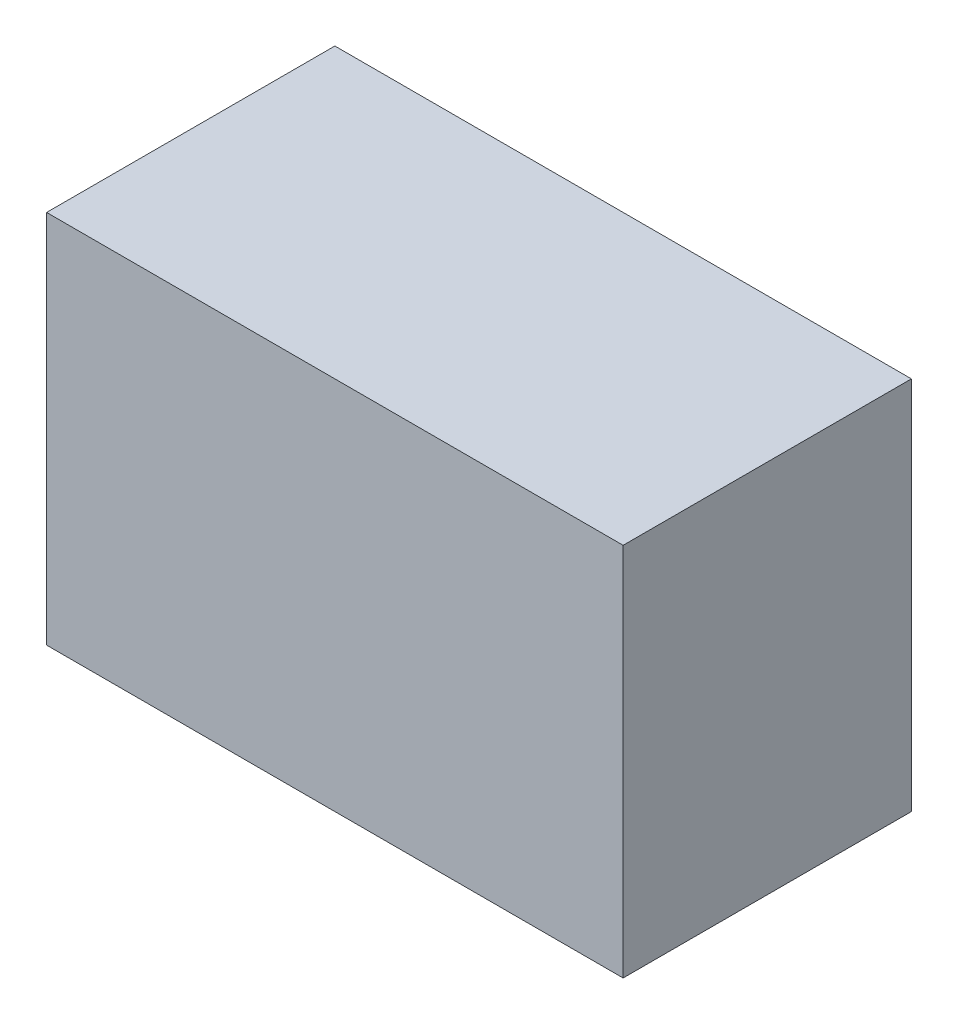
ISO-10303-21;
HEADER;
FILE_DESCRIPTION(('STEP AP214'),'2;1');
FILE_NAME('part.step','',(''),(''),'','','');
FILE_SCHEMA(('AUTOMOTIVE_DESIGN { 1 0 10303 214 1 1 1 1 }'));
ENDSEC;
DATA;
#1=APPLICATION_CONTEXT('core data for automotive mechanical design processes');
#2=APPLICATION_PROTOCOL_DEFINITION('international standard','automotive_design',2000,#1);
#3=PRODUCT_CONTEXT('',#1,'mechanical');
#4=PRODUCT('Part','Part','',(#3));
#5=PRODUCT_RELATED_PRODUCT_CATEGORY('part','',(#4));
#6=PRODUCT_DEFINITION_FORMATION('','',#4);
#7=PRODUCT_DEFINITION_CONTEXT('part definition',#1,'design');
#8=PRODUCT_DEFINITION('design','',#6,#7);
#9=PRODUCT_DEFINITION_SHAPE('','',#8);
#10=(LENGTH_UNIT() NAMED_UNIT(*) SI_UNIT(.MILLI.,.METRE.));
#11=(NAMED_UNIT(*) PLANE_ANGLE_UNIT() SI_UNIT($,.RADIAN.));
#12=(NAMED_UNIT(*) SI_UNIT($,.STERADIAN.) SOLID_ANGLE_UNIT());
#13=UNCERTAINTY_MEASURE_WITH_UNIT(LENGTH_MEASURE(1.E-05),#10,'distance_accuracy_value','');
#14=(GEOMETRIC_REPRESENTATION_CONTEXT(3) GLOBAL_UNCERTAINTY_ASSIGNED_CONTEXT((#13)) GLOBAL_UNIT_ASSIGNED_CONTEXT((#10,
#11,#12)) REPRESENTATION_CONTEXT('',''));
#15=CARTESIAN_POINT('',(0.,0.,0.));
#16=DIRECTION('',(0.,0.,1.));
#17=DIRECTION('',(1.,0.,0.));
#18=AXIS2_PLACEMENT_3D('',#15,#16,#17);
#19=CARTESIAN_POINT('',(0.,0.,1.));
#20=DIRECTION('',(0.,0.,1.));
#21=DIRECTION('',(1.,0.,0.));
#22=AXIS2_PLACEMENT_3D('',#19,#20,#21);
#23=PLANE('',#22);
#24=DIRECTION('',(1.,0.,0.));
#25=VECTOR('',#24,1.);
#26=CARTESIAN_POINT('',(1.,0.65,1.));
#27=LINE('',#26,#25);
#28=CARTESIAN_POINT('',(-1.,0.65,1.));
#29=VERTEX_POINT('',#28);
#30=CARTESIAN_POINT('',(1.,0.65,1.));
#31=VERTEX_POINT('',#30);
#32=EDGE_CURVE('E68',#29,#31,#27,.T.);
#33=ORIENTED_EDGE('',*,*,#32,.F.);
#34=DIRECTION('',(0.,1.,0.));
#35=VECTOR('',#34,1.);
#36=CARTESIAN_POINT('',(-1.,0.65,1.));
#37=LINE('',#36,#35);
#38=CARTESIAN_POINT('',(-1.,-0.65,1.));
#39=VERTEX_POINT('',#38);
#40=EDGE_CURVE('E20',#39,#29,#37,.T.);
#41=ORIENTED_EDGE('',*,*,#40,.F.);
#42=DIRECTION('',(1.,0.,0.));
#43=VECTOR('',#42,1.);
#44=CARTESIAN_POINT('',(-1.,-0.65,1.));
#45=LINE('',#44,#43);
#46=CARTESIAN_POINT('',(1.,-0.65,1.));
#47=VERTEX_POINT('',#46);
#48=EDGE_CURVE('E58',#47,#39,#45,.F.);
#49=ORIENTED_EDGE('',*,*,#48,.F.);
#50=DIRECTION('',(0.,1.,0.));
#51=VECTOR('',#50,1.);
#52=CARTESIAN_POINT('',(1.,-0.65,1.));
#53=LINE('',#52,#51);
#54=EDGE_CURVE('E53',#31,#47,#53,.F.);
#55=ORIENTED_EDGE('',*,*,#54,.F.);
#56=EDGE_LOOP('',(#33,#41,#49,#55));
#57=FACE_BOUND('',#56,.T.);
#58=ADVANCED_FACE('F17',(#57),#23,.T.);
#59=CARTESIAN_POINT('',(-1.,0.65,0.));
#60=DIRECTION('',(-1.,0.,0.));
#61=DIRECTION('',(0.,0.,1.));
#62=AXIS2_PLACEMENT_3D('',#59,#60,#61);
#63=PLANE('',#62);
#64=DIRECTION('',(0.,0.,1.));
#65=VECTOR('',#64,1.);
#66=CARTESIAN_POINT('',(-1.,0.65,0.));
#67=LINE('',#66,#65);
#68=CARTESIAN_POINT('',(-1.,0.65,0.));
#69=VERTEX_POINT('',#68);
#70=EDGE_CURVE('E79',#69,#29,#67,.T.);
#71=ORIENTED_EDGE('',*,*,#70,.F.);
#72=DIRECTION('',(0.,1.,0.));
#73=VECTOR('',#72,1.);
#74=CARTESIAN_POINT('',(-1.,0.,0.));
#75=LINE('',#74,#73);
#76=CARTESIAN_POINT('',(-1.,-0.65,0.));
#77=VERTEX_POINT('',#76);
#78=EDGE_CURVE('E74',#69,#77,#75,.F.);
#79=ORIENTED_EDGE('',*,*,#78,.T.);
#80=DIRECTION('',(0.,0.,-1.));
#81=VECTOR('',#80,1.);
#82=CARTESIAN_POINT('',(-1.,-0.65,0.));
#83=LINE('',#82,#81);
#84=EDGE_CURVE('E63',#39,#77,#83,.T.);
#85=ORIENTED_EDGE('',*,*,#84,.F.);
#86=ORIENTED_EDGE('',*,*,#40,.T.);
#87=EDGE_LOOP('',(#71,#79,#85,#86));
#88=FACE_BOUND('',#87,.T.);
#89=ADVANCED_FACE('F73',(#88),#63,.T.);
#90=CARTESIAN_POINT('',(-1.,-0.65,0.));
#91=DIRECTION('',(0.,-1.,0.));
#92=DIRECTION('',(0.,0.,-1.));
#93=AXIS2_PLACEMENT_3D('',#90,#91,#92);
#94=PLANE('',#93);
#95=ORIENTED_EDGE('',*,*,#84,.T.);
#96=DIRECTION('',(1.,0.,0.));
#97=VECTOR('',#96,1.);
#98=CARTESIAN_POINT('',(0.,-0.65,0.));
#99=LINE('',#98,#97);
#100=CARTESIAN_POINT('',(1.,-0.65,0.));
#101=VERTEX_POINT('',#100);
#102=EDGE_CURVE('E84',#77,#101,#99,.T.);
#103=ORIENTED_EDGE('',*,*,#102,.T.);
#104=DIRECTION('',(0.,0.,-1.));
#105=VECTOR('',#104,1.);
#106=CARTESIAN_POINT('',(1.,-0.65,0.));
#107=LINE('',#106,#105);
#108=EDGE_CURVE('E65',#47,#101,#107,.T.);
#109=ORIENTED_EDGE('',*,*,#108,.F.);
#110=ORIENTED_EDGE('',*,*,#48,.T.);
#111=EDGE_LOOP('',(#95,#103,#109,#110));
#112=FACE_BOUND('',#111,.T.);
#113=ADVANCED_FACE('F60',(#112),#94,.T.);
#114=CARTESIAN_POINT('',(1.,-0.65,0.));
#115=DIRECTION('',(1.,0.,0.));
#116=DIRECTION('',(0.,0.,-1.));
#117=AXIS2_PLACEMENT_3D('',#114,#115,#116);
#118=PLANE('',#117);
#119=ORIENTED_EDGE('',*,*,#108,.T.);
#120=DIRECTION('',(0.,1.,0.));
#121=VECTOR('',#120,1.);
#122=CARTESIAN_POINT('',(1.,0.,0.));
#123=LINE('',#122,#121);
#124=CARTESIAN_POINT('',(1.,0.65,0.));
#125=VERTEX_POINT('',#124);
#126=EDGE_CURVE('E26',#101,#125,#123,.T.);
#127=ORIENTED_EDGE('',*,*,#126,.T.);
#128=DIRECTION('',(0.,0.,1.));
#129=VECTOR('',#128,1.);
#130=CARTESIAN_POINT('',(1.,0.65,0.));
#131=LINE('',#130,#129);
#132=EDGE_CURVE('E34',#31,#125,#131,.F.);
#133=ORIENTED_EDGE('',*,*,#132,.F.);
#134=ORIENTED_EDGE('',*,*,#54,.T.);
#135=EDGE_LOOP('',(#119,#127,#133,#134));
#136=FACE_BOUND('',#135,.T.);
#137=ADVANCED_FACE('F88',(#136),#118,.T.);
#138=CARTESIAN_POINT('',(1.,0.65,0.));
#139=DIRECTION('',(0.,1.,0.));
#140=DIRECTION('',(0.,0.,1.));
#141=AXIS2_PLACEMENT_3D('',#138,#139,#140);
#142=PLANE('',#141);
#143=ORIENTED_EDGE('',*,*,#132,.T.);
#144=DIRECTION('',(1.,0.,0.));
#145=VECTOR('',#144,1.);
#146=CARTESIAN_POINT('',(0.,0.65,0.));
#147=LINE('',#146,#145);
#148=EDGE_CURVE('E11',#125,#69,#147,.F.);
#149=ORIENTED_EDGE('',*,*,#148,.T.);
#150=ORIENTED_EDGE('',*,*,#70,.T.);
#151=ORIENTED_EDGE('',*,*,#32,.T.);
#152=EDGE_LOOP('',(#143,#149,#150,#151));
#153=FACE_BOUND('',#152,.T.);
#154=ADVANCED_FACE('F91',(#153),#142,.T.);
#155=CARTESIAN_POINT('',(0.,0.,0.));
#156=DIRECTION('',(0.,0.,1.));
#157=DIRECTION('',(1.,0.,0.));
#158=AXIS2_PLACEMENT_3D('',#155,#156,#157);
#159=PLANE('',#158);
#160=ORIENTED_EDGE('',*,*,#126,.F.);
#161=ORIENTED_EDGE('',*,*,#102,.F.);
#162=ORIENTED_EDGE('',*,*,#78,.F.);
#163=ORIENTED_EDGE('',*,*,#148,.F.);
#164=EDGE_LOOP('',(#160,#161,#162,#163));
#165=FACE_BOUND('',#164,.T.);
#166=ADVANCED_FACE('F90',(#165),#159,.F.);
#167=CLOSED_SHELL('',(#58,#89,#113,#137,#154,#166));
#168=MANIFOLD_SOLID_BREP('B1',#167);
#169=ADVANCED_BREP_SHAPE_REPRESENTATION('',(#18,#168),#14);
#170=SHAPE_DEFINITION_REPRESENTATION(#9,#169);
ENDSEC;
END-ISO-10303-21;
